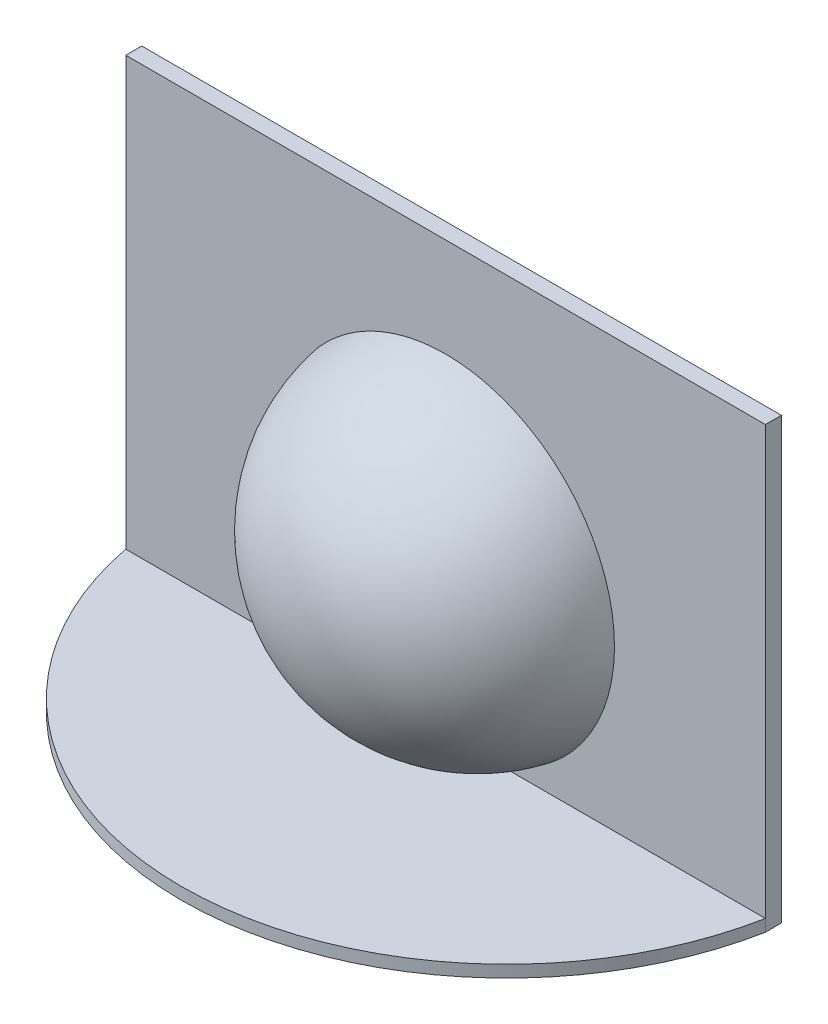
ISO-10303-21;
HEADER;
FILE_DESCRIPTION(('STEP AP214'),'2;1');
FILE_NAME('part.step','',(''),(''),'','','');
FILE_SCHEMA(('AUTOMOTIVE_DESIGN { 1 0 10303 214 1 1 1 1 }'));
ENDSEC;
DATA;
#1=APPLICATION_CONTEXT('core data for automotive mechanical design processes');
#2=APPLICATION_PROTOCOL_DEFINITION('international standard','automotive_design',2000,#1);
#3=PRODUCT_CONTEXT('',#1,'mechanical');
#4=PRODUCT('Part','Part','',(#3));
#5=PRODUCT_RELATED_PRODUCT_CATEGORY('part','',(#4));
#6=PRODUCT_DEFINITION_FORMATION('','',#4);
#7=PRODUCT_DEFINITION_CONTEXT('part definition',#1,'design');
#8=PRODUCT_DEFINITION('design','',#6,#7);
#9=PRODUCT_DEFINITION_SHAPE('','',#8);
#10=(LENGTH_UNIT() NAMED_UNIT(*) SI_UNIT(.MILLI.,.METRE.));
#11=(NAMED_UNIT(*) PLANE_ANGLE_UNIT() SI_UNIT($,.RADIAN.));
#12=(NAMED_UNIT(*) SI_UNIT($,.STERADIAN.) SOLID_ANGLE_UNIT());
#13=UNCERTAINTY_MEASURE_WITH_UNIT(LENGTH_MEASURE(1.E-05),#10,'distance_accuracy_value','');
#14=(GEOMETRIC_REPRESENTATION_CONTEXT(3) GLOBAL_UNCERTAINTY_ASSIGNED_CONTEXT((#13)) GLOBAL_UNIT_ASSIGNED_CONTEXT((#10,
#11,#12)) REPRESENTATION_CONTEXT('',''));
#15=CARTESIAN_POINT('',(0.,0.,0.));
#16=DIRECTION('',(0.,0.,1.));
#17=DIRECTION('',(1.,0.,0.));
#18=AXIS2_PLACEMENT_3D('',#15,#16,#17);
#19=CARTESIAN_POINT('',(-40.,33.5,2.));
#20=DIRECTION('',(-1.,0.,0.));
#21=DIRECTION('',(0.,-1.,0.));
#22=AXIS2_PLACEMENT_3D('',#19,#20,#21);
#23=PLANE('',#22);
#24=DIRECTION('',(0.,-1.,0.));
#25=VECTOR('',#24,1.);
#26=CARTESIAN_POINT('',(-40.,33.5,4.));
#27=LINE('',#26,#25);
#28=CARTESIAN_POINT('',(-40.,33.5,4.));
#29=VERTEX_POINT('',#28);
#30=CARTESIAN_POINT('',(-40.,-20.,4.));
#31=VERTEX_POINT('',#30);
#32=EDGE_CURVE('E115',#29,#31,#27,.T.);
#33=ORIENTED_EDGE('',*,*,#32,.F.);
#34=DIRECTION('',(0.,0.,1.));
#35=VECTOR('',#34,1.);
#36=CARTESIAN_POINT('',(-40.,33.5,2.));
#37=LINE('',#36,#35);
#38=CARTESIAN_POINT('',(-40.,33.5,2.));
#39=VERTEX_POINT('',#38);
#40=EDGE_CURVE('E60',#39,#29,#37,.T.);
#41=ORIENTED_EDGE('',*,*,#40,.F.);
#42=DIRECTION('',(0.,-1.,0.));
#43=VECTOR('',#42,1.);
#44=CARTESIAN_POINT('',(-40.,33.5,2.));
#45=LINE('',#44,#43);
#46=CARTESIAN_POINT('',(-40.,-21.5,2.));
#47=VERTEX_POINT('',#46);
#48=EDGE_CURVE('E128',#39,#47,#45,.T.);
#49=ORIENTED_EDGE('',*,*,#48,.T.);
#50=DIRECTION('',(0.,0.,1.));
#51=VECTOR('',#50,1.);
#52=CARTESIAN_POINT('',(-40.,-21.5,2.));
#53=LINE('',#52,#51);
#54=CARTESIAN_POINT('',(-40.,-21.5,4.));
#55=VERTEX_POINT('',#54);
#56=EDGE_CURVE('E81',#47,#55,#53,.T.);
#57=ORIENTED_EDGE('',*,*,#56,.T.);
#58=DIRECTION('',(0.,-1.,0.));
#59=VECTOR('',#58,1.);
#60=CARTESIAN_POINT('',(-40.,-20.,4.));
#61=LINE('',#60,#59);
#62=EDGE_CURVE('E102',#31,#55,#61,.T.);
#63=ORIENTED_EDGE('',*,*,#62,.F.);
#64=EDGE_LOOP('',(#33,#41,#49,#57,#63));
#65=FACE_BOUND('',#64,.T.);
#66=ADVANCED_FACE('F37',(#65),#23,.T.);
#67=CARTESIAN_POINT('',(-40.,33.5,2.));
#68=DIRECTION('',(0.,1.,0.));
#69=DIRECTION('',(-1.,0.,0.));
#70=AXIS2_PLACEMENT_3D('',#67,#68,#69);
#71=PLANE('',#70);
#72=DIRECTION('',(-1.,0.,0.));
#73=VECTOR('',#72,1.);
#74=CARTESIAN_POINT('',(-40.,33.5,4.));
#75=LINE('',#74,#73);
#76=CARTESIAN_POINT('',(40.,33.5,4.));
#77=VERTEX_POINT('',#76);
#78=EDGE_CURVE('E119',#77,#29,#75,.T.);
#79=ORIENTED_EDGE('',*,*,#78,.F.);
#80=DIRECTION('',(0.,0.,1.));
#81=VECTOR('',#80,1.);
#82=CARTESIAN_POINT('',(40.,33.5,2.));
#83=LINE('',#82,#81);
#84=CARTESIAN_POINT('',(40.,33.5,2.));
#85=VERTEX_POINT('',#84);
#86=EDGE_CURVE('E130',#85,#77,#83,.T.);
#87=ORIENTED_EDGE('',*,*,#86,.F.);
#88=DIRECTION('',(-1.,0.,0.));
#89=VECTOR('',#88,1.);
#90=CARTESIAN_POINT('',(-40.,33.5,2.));
#91=LINE('',#90,#89);
#92=EDGE_CURVE('E124',#85,#39,#91,.T.);
#93=ORIENTED_EDGE('',*,*,#92,.T.);
#94=ORIENTED_EDGE('',*,*,#40,.T.);
#95=EDGE_LOOP('',(#79,#87,#93,#94));
#96=FACE_BOUND('',#95,.T.);
#97=ADVANCED_FACE('F144',(#96),#71,.T.);
#98=CARTESIAN_POINT('',(40.,33.5,2.));
#99=DIRECTION('',(1.,0.,0.));
#100=DIRECTION('',(0.,1.,0.));
#101=AXIS2_PLACEMENT_3D('',#98,#99,#100);
#102=PLANE('',#101);
#103=DIRECTION('',(0.,1.,0.));
#104=VECTOR('',#103,1.);
#105=CARTESIAN_POINT('',(40.,33.5,4.));
#106=LINE('',#105,#104);
#107=CARTESIAN_POINT('',(40.,-21.5,4.));
#108=VERTEX_POINT('',#107);
#109=CARTESIAN_POINT('',(40.,-20.,4.));
#110=VERTEX_POINT('',#109);
#111=EDGE_CURVE('E104',#108,#110,#106,.T.);
#112=ORIENTED_EDGE('',*,*,#111,.F.);
#113=DIRECTION('',(0.,0.,1.));
#114=VECTOR('',#113,1.);
#115=CARTESIAN_POINT('',(40.,-21.5,2.));
#116=LINE('',#115,#114);
#117=CARTESIAN_POINT('',(40.,-21.5,2.));
#118=VERTEX_POINT('',#117);
#119=EDGE_CURVE('E133',#118,#108,#116,.T.);
#120=ORIENTED_EDGE('',*,*,#119,.F.);
#121=DIRECTION('',(0.,1.,0.));
#122=VECTOR('',#121,1.);
#123=CARTESIAN_POINT('',(40.,33.5,2.));
#124=LINE('',#123,#122);
#125=EDGE_CURVE('E142',#118,#85,#124,.T.);
#126=ORIENTED_EDGE('',*,*,#125,.T.);
#127=ORIENTED_EDGE('',*,*,#86,.T.);
#128=EDGE_CURVE('E120',#110,#77,#106,.T.);
#129=ORIENTED_EDGE('',*,*,#128,.F.);
#130=EDGE_LOOP('',(#112,#120,#126,#127,#129));
#131=FACE_BOUND('',#130,.T.);
#132=ADVANCED_FACE('F139',(#131),#102,.T.);
#133=CARTESIAN_POINT('',(-40.,-21.5,2.));
#134=DIRECTION('',(0.,-1.,0.));
#135=DIRECTION('',(1.,0.,0.));
#136=AXIS2_PLACEMENT_3D('',#133,#134,#135);
#137=PLANE('',#136);
#138=ORIENTED_EDGE('',*,*,#119,.T.);
#139=CARTESIAN_POINT('',(0.,-21.5,-3.6713656596441));
#140=DIRECTION('',(0.,-1.,0.));
#141=DIRECTION('',(-1.,0.,0.));
#142=AXIS2_PLACEMENT_3D('',#139,#140,#141);
#143=CIRCLE('',#142,40.7289804817647);
#144=EDGE_CURVE('E105',#108,#55,#143,.T.);
#145=ORIENTED_EDGE('',*,*,#144,.T.);
#146=ORIENTED_EDGE('',*,*,#56,.F.);
#147=DIRECTION('',(1.,0.,0.));
#148=VECTOR('',#147,1.);
#149=CARTESIAN_POINT('',(-40.,-21.5,2.));
#150=LINE('',#149,#148);
#151=EDGE_CURVE('E162',#47,#118,#150,.T.);
#152=ORIENTED_EDGE('',*,*,#151,.T.);
#153=EDGE_LOOP('',(#138,#145,#146,#152));
#154=FACE_BOUND('',#153,.T.);
#155=ADVANCED_FACE('F151',(#154),#137,.T.);
#156=CARTESIAN_POINT('',(0.,0.,2.));
#157=DIRECTION('',(0.,0.,1.));
#158=DIRECTION('',(1.,0.,0.));
#159=AXIS2_PLACEMENT_3D('',#156,#157,#158);
#160=PLANE('',#159);
#161=ORIENTED_EDGE('',*,*,#48,.F.);
#162=ORIENTED_EDGE('',*,*,#92,.F.);
#163=ORIENTED_EDGE('',*,*,#125,.F.);
#164=ORIENTED_EDGE('',*,*,#151,.F.);
#165=EDGE_LOOP('',(#161,#162,#163,#164));
#166=FACE_BOUND('',#165,.T.);
#167=ADVANCED_FACE('F157',(#166),#160,.F.);
#168=CARTESIAN_POINT('',(0.,0.,4.));
#169=DIRECTION('',(0.,0.,1.));
#170=DIRECTION('',(1.,0.,0.));
#171=AXIS2_PLACEMENT_3D('',#168,#169,#170);
#172=PLANE('',#171);
#173=DIRECTION('',(1.,0.,0.));
#174=VECTOR('',#173,1.);
#175=CARTESIAN_POINT('',(-40.,-20.,4.));
#176=LINE('',#175,#174);
#177=CARTESIAN_POINT('',(6.80073525436774,-20.,4.));
#178=VERTEX_POINT('',#177);
#179=EDGE_CURVE('E52',#178,#110,#176,.T.);
#180=ORIENTED_EDGE('',*,*,#179,.T.);
#181=ORIENTED_EDGE('',*,*,#128,.T.);
#182=ORIENTED_EDGE('',*,*,#78,.T.);
#183=ORIENTED_EDGE('',*,*,#32,.T.);
#184=CARTESIAN_POINT('',(-6.80073525436773,-20.,4.));
#185=VERTEX_POINT('',#184);
#186=EDGE_CURVE('E108',#31,#185,#176,.T.);
#187=ORIENTED_EDGE('',*,*,#186,.T.);
#188=CARTESIAN_POINT('',(0.,0.,4.));
#189=DIRECTION('',(0.,0.,1.));
#190=DIRECTION('',(1.,0.,0.));
#191=AXIS2_PLACEMENT_3D('',#188,#189,#190);
#192=CIRCLE('',#191,21.1246301742776);
#193=EDGE_CURVE('E45',#178,#185,#192,.T.);
#194=ORIENTED_EDGE('',*,*,#193,.F.);
#195=EDGE_LOOP('',(#180,#181,#182,#183,#187,#194));
#196=FACE_BOUND('',#195,.T.);
#197=ADVANCED_FACE('F118',(#196),#172,.T.);
#198=CARTESIAN_POINT('',(0.,0.,0.));
#199=DIRECTION('',(0.,1.,0.));
#200=DIRECTION('',(1.,0.,0.));
#201=AXIS2_PLACEMENT_3D('',#198,#199,#200);
#202=SPHERICAL_SURFACE('',#201,21.5);
#203=ORIENTED_EDGE('',*,*,#193,.T.);
#204=CARTESIAN_POINT('',(0.,-20.,0.));
#205=DIRECTION('',(0.,1.,0.));
#206=DIRECTION('',(-1.,0.,0.));
#207=AXIS2_PLACEMENT_3D('',#204,#205,#206);
#208=CIRCLE('',#207,7.88986691902976);
#209=EDGE_CURVE('E11',#185,#178,#208,.T.);
#210=ORIENTED_EDGE('',*,*,#209,.T.);
#211=EDGE_LOOP('',(#203,#210));
#212=FACE_BOUND('',#211,.T.);
#213=ADVANCED_FACE('F39',(#212),#202,.T.);
#214=CARTESIAN_POINT('',(0.,-20.,-3.6713656596441));
#215=DIRECTION('',(0.,-1.,0.));
#216=DIRECTION('',(1.,0.,0.));
#217=AXIS2_PLACEMENT_3D('',#214,#215,#216);
#218=CYLINDRICAL_SURFACE('',#217,40.7289804817647);
#219=ORIENTED_EDGE('',*,*,#144,.F.);
#220=ORIENTED_EDGE('',*,*,#111,.T.);
#221=CARTESIAN_POINT('',(0.,-20.,-3.6713656596441));
#222=DIRECTION('',(0.,-1.,0.));
#223=DIRECTION('',(-1.,0.,0.));
#224=AXIS2_PLACEMENT_3D('',#221,#222,#223);
#225=CIRCLE('',#224,40.7289804817647);
#226=EDGE_CURVE('E98',#110,#31,#225,.T.);
#227=ORIENTED_EDGE('',*,*,#226,.T.);
#228=ORIENTED_EDGE('',*,*,#62,.T.);
#229=EDGE_LOOP('',(#219,#220,#227,#228));
#230=FACE_BOUND('',#229,.T.);
#231=ADVANCED_FACE('F100',(#230),#218,.T.);
#232=CARTESIAN_POINT('',(0.,-20.,-3.6713656596441));
#233=DIRECTION('',(0.,1.,0.));
#234=DIRECTION('',(-1.,0.,0.));
#235=AXIS2_PLACEMENT_3D('',#232,#233,#234);
#236=PLANE('',#235);
#237=ORIENTED_EDGE('',*,*,#209,.F.);
#238=ORIENTED_EDGE('',*,*,#186,.F.);
#239=ORIENTED_EDGE('',*,*,#226,.F.);
#240=ORIENTED_EDGE('',*,*,#179,.F.);
#241=EDGE_LOOP('',(#237,#238,#239,#240));
#242=FACE_BOUND('',#241,.T.);
#243=ADVANCED_FACE('F109',(#242),#236,.T.);
#244=CLOSED_SHELL('',(#66,#97,#132,#155,#167,#197,#213,#231,#243));
#245=MANIFOLD_SOLID_BREP('B2',#244);
#246=ADVANCED_BREP_SHAPE_REPRESENTATION('',(#18,#245),#14);
#247=SHAPE_DEFINITION_REPRESENTATION(#9,#246);
ENDSEC;
END-ISO-10303-21;
